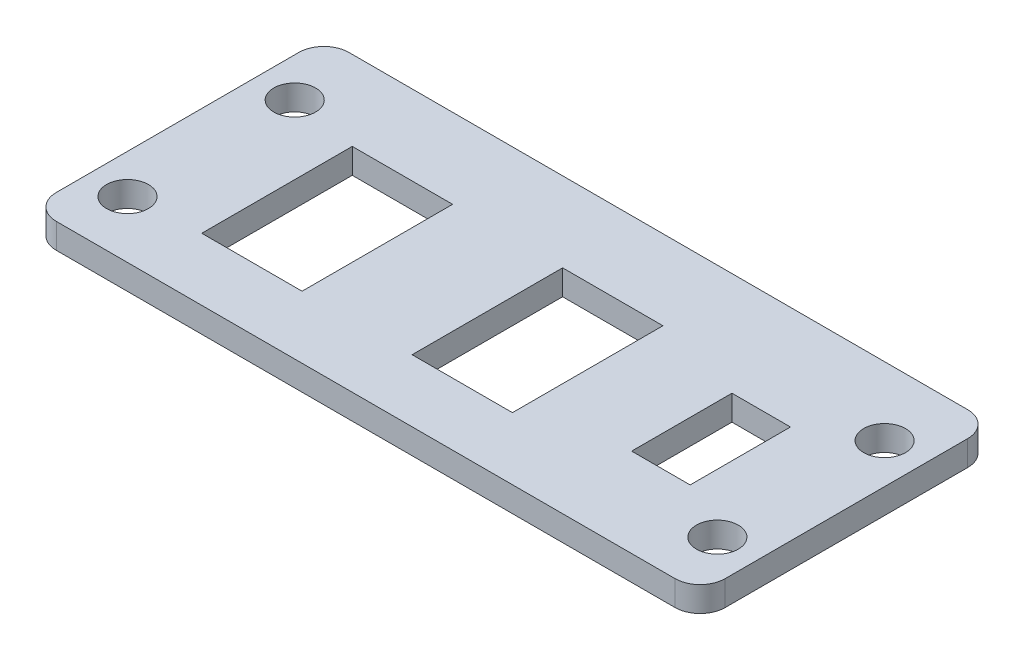
ISO-10303-21;
HEADER;
FILE_DESCRIPTION(('STEP AP214'),'2;1');
FILE_NAME('part.step','',(''),(''),'','','');
FILE_SCHEMA(('AUTOMOTIVE_DESIGN { 1 0 10303 214 1 1 1 1 }'));
ENDSEC;
DATA;
#1=APPLICATION_CONTEXT('core data for automotive mechanical design processes');
#2=APPLICATION_PROTOCOL_DEFINITION('international standard','automotive_design',2000,#1);
#3=PRODUCT_CONTEXT('',#1,'mechanical');
#4=PRODUCT('Part','Part','',(#3));
#5=PRODUCT_RELATED_PRODUCT_CATEGORY('part','',(#4));
#6=PRODUCT_DEFINITION_FORMATION('','',#4);
#7=PRODUCT_DEFINITION_CONTEXT('part definition',#1,'design');
#8=PRODUCT_DEFINITION('design','',#6,#7);
#9=PRODUCT_DEFINITION_SHAPE('','',#8);
#10=(LENGTH_UNIT() NAMED_UNIT(*) SI_UNIT(.MILLI.,.METRE.));
#11=(NAMED_UNIT(*) PLANE_ANGLE_UNIT() SI_UNIT($,.RADIAN.));
#12=(NAMED_UNIT(*) SI_UNIT($,.STERADIAN.) SOLID_ANGLE_UNIT());
#13=UNCERTAINTY_MEASURE_WITH_UNIT(LENGTH_MEASURE(1.E-05),#10,'distance_accuracy_value','');
#14=(GEOMETRIC_REPRESENTATION_CONTEXT(3) GLOBAL_UNCERTAINTY_ASSIGNED_CONTEXT((#13)) GLOBAL_UNIT_ASSIGNED_CONTEXT((#10,
#11,#12)) REPRESENTATION_CONTEXT('',''));
#15=CARTESIAN_POINT('',(0.,0.,0.));
#16=DIRECTION('',(0.,0.,1.));
#17=DIRECTION('',(1.,0.,0.));
#18=AXIS2_PLACEMENT_3D('',#15,#16,#17);
#19=CARTESIAN_POINT('',(0.,3.,0.));
#20=DIRECTION('',(0.,-1.,0.));
#21=DIRECTION('',(0.,0.,-1.));
#22=AXIS2_PLACEMENT_3D('',#19,#20,#21);
#23=PLANE('',#22);
#24=DIRECTION('',(0.,0.,1.));
#25=VECTOR('',#24,1.);
#26=CARTESIAN_POINT('',(332.334815931051,3.,75.4891037068991));
#27=LINE('',#26,#25);
#28=CARTESIAN_POINT('',(332.334815931051,3.,75.4891037068991));
#29=VERTEX_POINT('',#28);
#30=CARTESIAN_POINT('',(332.334815931051,3.,87.4891037068991));
#31=VERTEX_POINT('',#30);
#32=EDGE_CURVE('E411',#29,#31,#27,.T.);
#33=ORIENTED_EDGE('',*,*,#32,.F.);
#34=DIRECTION('',(-1.,0.,0.));
#35=VECTOR('',#34,1.);
#36=CARTESIAN_POINT('',(332.334815931051,3.,75.4891037068991));
#37=LINE('',#36,#35);
#38=CARTESIAN_POINT('',(339.334815931051,3.,75.4891037068991));
#39=VERTEX_POINT('',#38);
#40=EDGE_CURVE('E421',#39,#29,#37,.T.);
#41=ORIENTED_EDGE('',*,*,#40,.F.);
#42=DIRECTION('',(0.,0.,-1.));
#43=VECTOR('',#42,1.);
#44=CARTESIAN_POINT('',(339.334815931051,3.,75.4891037068991));
#45=LINE('',#44,#43);
#46=CARTESIAN_POINT('',(339.334815931051,3.,87.4891037068991));
#47=VERTEX_POINT('',#46);
#48=EDGE_CURVE('E426',#47,#39,#45,.T.);
#49=ORIENTED_EDGE('',*,*,#48,.F.);
#50=DIRECTION('',(1.,0.,0.));
#51=VECTOR('',#50,1.);
#52=CARTESIAN_POINT('',(332.334815931051,3.,87.4891037068991));
#53=LINE('',#52,#51);
#54=EDGE_CURVE('E414',#31,#47,#53,.T.);
#55=ORIENTED_EDGE('',*,*,#54,.F.);
#56=EDGE_LOOP('',(#33,#41,#49,#55));
#57=FACE_BOUND('',#56,.T.);
#58=DIRECTION('',(0.,0.,1.));
#59=VECTOR('',#58,1.);
#60=CARTESIAN_POINT('',(271.134650113553,3.,98.0957153332644));
#61=LINE('',#60,#59);
#62=CARTESIAN_POINT('',(271.134650113553,3.,66.0957153332644));
#63=VERTEX_POINT('',#62);
#64=CARTESIAN_POINT('',(271.134650113553,3.,95.0957153332644));
#65=VERTEX_POINT('',#64);
#66=EDGE_CURVE('E297',#63,#65,#61,.T.);
#67=ORIENTED_EDGE('',*,*,#66,.T.);
#68=CARTESIAN_POINT('',(274.134650113553,3.,95.0957153332644));
#69=DIRECTION('',(0.,-1.,0.));
#70=DIRECTION('',(0.,0.,-1.));
#71=AXIS2_PLACEMENT_3D('',#68,#69,#70);
#72=CIRCLE('',#71,3.);
#73=CARTESIAN_POINT('',(274.134650113553,3.,98.0957153332644));
#74=VERTEX_POINT('',#73);
#75=EDGE_CURVE('E353',#65,#74,#72,.F.);
#76=ORIENTED_EDGE('',*,*,#75,.T.);
#77=DIRECTION('',(1.,0.,0.));
#78=VECTOR('',#77,1.);
#79=CARTESIAN_POINT('',(271.134650113553,3.,98.0957153332644));
#80=LINE('',#79,#78);
#81=CARTESIAN_POINT('',(348.134650113553,3.,98.0957153332644));
#82=VERTEX_POINT('',#81);
#83=EDGE_CURVE('E302',#74,#82,#80,.T.);
#84=ORIENTED_EDGE('',*,*,#83,.T.);
#85=CARTESIAN_POINT('',(348.134650113553,3.,95.0957153332644));
#86=DIRECTION('',(0.,-1.,0.));
#87=DIRECTION('',(0.,0.,-1.));
#88=AXIS2_PLACEMENT_3D('',#85,#86,#87);
#89=CIRCLE('',#88,3.);
#90=CARTESIAN_POINT('',(351.134650113553,3.,95.0957153332644));
#91=VERTEX_POINT('',#90);
#92=EDGE_CURVE('E345',#82,#91,#89,.F.);
#93=ORIENTED_EDGE('',*,*,#92,.T.);
#94=DIRECTION('',(0.,0.,-1.));
#95=VECTOR('',#94,1.);
#96=CARTESIAN_POINT('',(351.134650113553,3.,98.0957153332644));
#97=LINE('',#96,#95);
#98=CARTESIAN_POINT('',(351.134650113553,3.,66.0957153332644));
#99=VERTEX_POINT('',#98);
#100=EDGE_CURVE('E311',#91,#99,#97,.T.);
#101=ORIENTED_EDGE('',*,*,#100,.T.);
#102=CARTESIAN_POINT('',(348.134650113553,3.,66.0957153332644));
#103=DIRECTION('',(0.,-1.,0.));
#104=DIRECTION('',(0.,0.,-1.));
#105=AXIS2_PLACEMENT_3D('',#102,#103,#104);
#106=CIRCLE('',#105,3.);
#107=CARTESIAN_POINT('',(348.134650113553,3.,63.0957153332644));
#108=VERTEX_POINT('',#107);
#109=EDGE_CURVE('E60',#99,#108,#106,.F.);
#110=ORIENTED_EDGE('',*,*,#109,.T.);
#111=DIRECTION('',(-1.,0.,0.));
#112=VECTOR('',#111,1.);
#113=CARTESIAN_POINT('',(271.134650113553,3.,63.0957153332644));
#114=LINE('',#113,#112);
#115=CARTESIAN_POINT('',(274.134650113553,3.,63.0957153332644));
#116=VERTEX_POINT('',#115);
#117=EDGE_CURVE('E314',#108,#116,#114,.T.);
#118=ORIENTED_EDGE('',*,*,#117,.T.);
#119=CARTESIAN_POINT('',(274.134650113553,3.,66.0957153332644));
#120=DIRECTION('',(0.,-1.,0.));
#121=DIRECTION('',(0.,0.,-1.));
#122=AXIS2_PLACEMENT_3D('',#119,#120,#121);
#123=CIRCLE('',#122,3.);
#124=EDGE_CURVE('E350',#116,#63,#123,.F.);
#125=ORIENTED_EDGE('',*,*,#124,.T.);
#126=EDGE_LOOP('',(#67,#76,#84,#93,#101,#110,#118,#125));
#127=FACE_BOUND('',#126,.T.);
#128=DIRECTION('',(0.,0.,1.));
#129=VECTOR('',#128,1.);
#130=CARTESIAN_POINT('',(309.220523963616,3.,72.6297014973218));
#131=LINE('',#130,#129);
#132=CARTESIAN_POINT('',(309.220523963616,3.,72.6297014973218));
#133=VERTEX_POINT('',#132);
#134=CARTESIAN_POINT('',(309.220523963616,3.,90.6297014973218));
#135=VERTEX_POINT('',#134);
#136=EDGE_CURVE('E257',#133,#135,#131,.T.);
#137=ORIENTED_EDGE('',*,*,#136,.F.);
#138=DIRECTION('',(-1.,0.,0.));
#139=VECTOR('',#138,1.);
#140=CARTESIAN_POINT('',(309.220523963616,3.,72.6297014973218));
#141=LINE('',#140,#139);
#142=CARTESIAN_POINT('',(321.220523963616,3.,72.6297014973218));
#143=VERTEX_POINT('',#142);
#144=EDGE_CURVE('E270',#143,#133,#141,.T.);
#145=ORIENTED_EDGE('',*,*,#144,.F.);
#146=DIRECTION('',(0.,0.,-1.));
#147=VECTOR('',#146,1.);
#148=CARTESIAN_POINT('',(321.220523963616,3.,72.6297014973218));
#149=LINE('',#148,#147);
#150=CARTESIAN_POINT('',(321.220523963616,3.,90.6297014973218));
#151=VERTEX_POINT('',#150);
#152=EDGE_CURVE('E275',#151,#143,#149,.T.);
#153=ORIENTED_EDGE('',*,*,#152,.F.);
#154=DIRECTION('',(1.,0.,0.));
#155=VECTOR('',#154,1.);
#156=CARTESIAN_POINT('',(309.220523963616,3.,90.6297014973218));
#157=LINE('',#156,#155);
#158=EDGE_CURVE('E260',#135,#151,#157,.T.);
#159=ORIENTED_EDGE('',*,*,#158,.F.);
#160=EDGE_LOOP('',(#137,#145,#153,#159));
#161=FACE_BOUND('',#160,.T.);
#162=CARTESIAN_POINT('',(275.818253152664,3.,71.2682978629817));
#163=DIRECTION('',(0.,1.,0.));
#164=DIRECTION('',(0.,0.,1.));
#165=AXIS2_PLACEMENT_3D('',#162,#163,#164);
#166=CIRCLE('',#165,2.50000000000002);
#167=CARTESIAN_POINT('',(275.818253152664,3.,73.7682978629818));
#168=VERTEX_POINT('',#167);
#169=EDGE_CURVE('E249',#168,#168,#166,.T.);
#170=ORIENTED_EDGE('',*,*,#169,.F.);
#171=EDGE_LOOP('',(#170));
#172=FACE_BOUND('',#171,.T.);
#173=CARTESIAN_POINT('',(275.818253152664,3.,91.2682978629817));
#174=DIRECTION('',(0.,1.,0.));
#175=DIRECTION('',(0.,0.,1.));
#176=AXIS2_PLACEMENT_3D('',#173,#174,#175);
#177=CIRCLE('',#176,2.50000000000002);
#178=CARTESIAN_POINT('',(275.818253152664,3.,93.7682978629818));
#179=VERTEX_POINT('',#178);
#180=EDGE_CURVE('E238',#179,#179,#177,.T.);
#181=ORIENTED_EDGE('',*,*,#180,.F.);
#182=EDGE_LOOP('',(#181));
#183=FACE_BOUND('',#182,.T.);
#184=CARTESIAN_POINT('',(346.370521359397,3.,71.2682978629817));
#185=DIRECTION('',(0.,1.,0.));
#186=DIRECTION('',(0.,0.,1.));
#187=AXIS2_PLACEMENT_3D('',#184,#185,#186);
#188=CIRCLE('',#187,2.50000000000002);
#189=CARTESIAN_POINT('',(346.370521359397,3.,73.7682978629818));
#190=VERTEX_POINT('',#189);
#191=EDGE_CURVE('E230',#190,#190,#188,.T.);
#192=ORIENTED_EDGE('',*,*,#191,.F.);
#193=EDGE_LOOP('',(#192));
#194=FACE_BOUND('',#193,.T.);
#195=CARTESIAN_POINT('',(346.370521359397,3.,91.2682978629817));
#196=DIRECTION('',(0.,1.,0.));
#197=DIRECTION('',(0.,0.,1.));
#198=AXIS2_PLACEMENT_3D('',#195,#196,#197);
#199=CIRCLE('',#198,2.50000000000002);
#200=CARTESIAN_POINT('',(346.370521359397,3.,93.7682978629818));
#201=VERTEX_POINT('',#200);
#202=EDGE_CURVE('E219',#201,#201,#199,.T.);
#203=ORIENTED_EDGE('',*,*,#202,.F.);
#204=EDGE_LOOP('',(#203));
#205=FACE_BOUND('',#204,.T.);
#206=DIRECTION('',(0.,0.,1.));
#207=VECTOR('',#206,1.);
#208=CARTESIAN_POINT('',(284.062529159449,3.,72.6297014973218));
#209=LINE('',#208,#207);
#210=CARTESIAN_POINT('',(284.062529159449,3.,72.6297014973218));
#211=VERTEX_POINT('',#210);
#212=CARTESIAN_POINT('',(284.062529159449,3.,90.6297014973218));
#213=VERTEX_POINT('',#212);
#214=EDGE_CURVE('E177',#211,#213,#209,.T.);
#215=ORIENTED_EDGE('',*,*,#214,.F.);
#216=DIRECTION('',(-1.,0.,0.));
#217=VECTOR('',#216,1.);
#218=CARTESIAN_POINT('',(284.062529159449,3.,72.6297014973218));
#219=LINE('',#218,#217);
#220=CARTESIAN_POINT('',(296.062529159449,3.,72.6297014973218));
#221=VERTEX_POINT('',#220);
#222=EDGE_CURVE('E204',#221,#211,#219,.T.);
#223=ORIENTED_EDGE('',*,*,#222,.F.);
#224=DIRECTION('',(0.,0.,-1.));
#225=VECTOR('',#224,1.);
#226=CARTESIAN_POINT('',(296.062529159449,3.,72.6297014973218));
#227=LINE('',#226,#225);
#228=CARTESIAN_POINT('',(296.062529159449,3.,90.6297014973218));
#229=VERTEX_POINT('',#228);
#230=EDGE_CURVE('E201',#229,#221,#227,.T.);
#231=ORIENTED_EDGE('',*,*,#230,.F.);
#232=DIRECTION('',(1.,0.,0.));
#233=VECTOR('',#232,1.);
#234=CARTESIAN_POINT('',(284.062529159449,3.,90.6297014973218));
#235=LINE('',#234,#233);
#236=EDGE_CURVE('E188',#213,#229,#235,.T.);
#237=ORIENTED_EDGE('',*,*,#236,.F.);
#238=EDGE_LOOP('',(#215,#223,#231,#237));
#239=FACE_BOUND('',#238,.T.);
#240=ADVANCED_FACE('F38',(#57,#127,#161,#172,#183,#194,#205,#239),#23,.F.);
#241=CARTESIAN_POINT('',(0.,0.,0.));
#242=DIRECTION('',(0.,-1.,0.));
#243=DIRECTION('',(0.,0.,-1.));
#244=AXIS2_PLACEMENT_3D('',#241,#242,#243);
#245=PLANE('',#244);
#246=CARTESIAN_POINT('',(346.370521359397,0.,71.2682978629817));
#247=DIRECTION('',(0.,1.,0.));
#248=DIRECTION('',(0.,0.,1.));
#249=AXIS2_PLACEMENT_3D('',#246,#247,#248);
#250=CIRCLE('',#249,2.50000000000002);
#251=CARTESIAN_POINT('',(346.370521359397,0.,73.7682978629818));
#252=VERTEX_POINT('',#251);
#253=EDGE_CURVE('E225',#252,#252,#250,.T.);
#254=ORIENTED_EDGE('',*,*,#253,.T.);
#255=EDGE_LOOP('',(#254));
#256=FACE_BOUND('',#255,.T.);
#257=CARTESIAN_POINT('',(275.818253152664,0.,71.2682978629817));
#258=DIRECTION('',(0.,1.,0.));
#259=DIRECTION('',(0.,0.,1.));
#260=AXIS2_PLACEMENT_3D('',#257,#258,#259);
#261=CIRCLE('',#260,2.50000000000002);
#262=CARTESIAN_POINT('',(275.818253152664,0.,73.7682978629818));
#263=VERTEX_POINT('',#262);
#264=EDGE_CURVE('E243',#263,#263,#261,.T.);
#265=ORIENTED_EDGE('',*,*,#264,.T.);
#266=EDGE_LOOP('',(#265));
#267=FACE_BOUND('',#266,.T.);
#268=DIRECTION('',(1.,0.,0.));
#269=VECTOR('',#268,1.);
#270=CARTESIAN_POINT('',(271.134650113553,0.,98.0957153332644));
#271=LINE('',#270,#269);
#272=CARTESIAN_POINT('',(274.134650113553,0.,98.0957153332644));
#273=VERTEX_POINT('',#272);
#274=CARTESIAN_POINT('',(348.134650113553,0.,98.0957153332644));
#275=VERTEX_POINT('',#274);
#276=EDGE_CURVE('E321',#273,#275,#271,.T.);
#277=ORIENTED_EDGE('',*,*,#276,.F.);
#278=CARTESIAN_POINT('',(274.134650113553,0.,95.0957153332644));
#279=DIRECTION('',(0.,-1.,0.));
#280=DIRECTION('',(0.,0.,-1.));
#281=AXIS2_PLACEMENT_3D('',#278,#279,#280);
#282=CIRCLE('',#281,3.);
#283=CARTESIAN_POINT('',(271.134650113553,0.,95.0957153332644));
#284=VERTEX_POINT('',#283);
#285=EDGE_CURVE('E338',#273,#284,#282,.T.);
#286=ORIENTED_EDGE('',*,*,#285,.T.);
#287=DIRECTION('',(0.,0.,1.));
#288=VECTOR('',#287,1.);
#289=CARTESIAN_POINT('',(271.134650113553,0.,98.0957153332644));
#290=LINE('',#289,#288);
#291=CARTESIAN_POINT('',(271.134650113553,0.,66.0957153332644));
#292=VERTEX_POINT('',#291);
#293=EDGE_CURVE('E296',#292,#284,#290,.T.);
#294=ORIENTED_EDGE('',*,*,#293,.F.);
#295=CARTESIAN_POINT('',(274.134650113553,0.,66.0957153332644));
#296=DIRECTION('',(0.,-1.,0.));
#297=DIRECTION('',(0.,0.,-1.));
#298=AXIS2_PLACEMENT_3D('',#295,#296,#297);
#299=CIRCLE('',#298,3.);
#300=CARTESIAN_POINT('',(274.134650113553,0.,63.0957153332644));
#301=VERTEX_POINT('',#300);
#302=EDGE_CURVE('E336',#292,#301,#299,.T.);
#303=ORIENTED_EDGE('',*,*,#302,.T.);
#304=DIRECTION('',(-1.,0.,0.));
#305=VECTOR('',#304,1.);
#306=CARTESIAN_POINT('',(271.134650113553,0.,63.0957153332644));
#307=LINE('',#306,#305);
#308=CARTESIAN_POINT('',(348.134650113553,0.,63.0957153332644));
#309=VERTEX_POINT('',#308);
#310=EDGE_CURVE('E303',#309,#301,#307,.T.);
#311=ORIENTED_EDGE('',*,*,#310,.F.);
#312=CARTESIAN_POINT('',(348.134650113553,0.,66.0957153332644));
#313=DIRECTION('',(0.,-1.,0.));
#314=DIRECTION('',(0.,0.,-1.));
#315=AXIS2_PLACEMENT_3D('',#312,#313,#314);
#316=CIRCLE('',#315,3.);
#317=CARTESIAN_POINT('',(351.134650113553,0.,66.0957153332644));
#318=VERTEX_POINT('',#317);
#319=EDGE_CURVE('E334',#309,#318,#316,.T.);
#320=ORIENTED_EDGE('',*,*,#319,.T.);
#321=DIRECTION('',(0.,0.,-1.));
#322=VECTOR('',#321,1.);
#323=CARTESIAN_POINT('',(351.134650113553,0.,98.0957153332644));
#324=LINE('',#323,#322);
#325=CARTESIAN_POINT('',(351.134650113553,0.,95.0957153332644));
#326=VERTEX_POINT('',#325);
#327=EDGE_CURVE('E324',#326,#318,#324,.T.);
#328=ORIENTED_EDGE('',*,*,#327,.F.);
#329=CARTESIAN_POINT('',(348.134650113553,0.,95.0957153332644));
#330=DIRECTION('',(0.,-1.,0.));
#331=DIRECTION('',(0.,0.,-1.));
#332=AXIS2_PLACEMENT_3D('',#329,#330,#331);
#333=CIRCLE('',#332,3.);
#334=EDGE_CURVE('E332',#326,#275,#333,.T.);
#335=ORIENTED_EDGE('',*,*,#334,.T.);
#336=EDGE_LOOP('',(#277,#286,#294,#303,#311,#320,#328,#335));
#337=FACE_BOUND('',#336,.T.);
#338=DIRECTION('',(-1.,0.,0.));
#339=VECTOR('',#338,1.);
#340=CARTESIAN_POINT('',(309.220523963616,0.,72.6297014973218));
#341=LINE('',#340,#339);
#342=CARTESIAN_POINT('',(321.220523963616,0.,72.6297014973218));
#343=VERTEX_POINT('',#342);
#344=CARTESIAN_POINT('',(309.220523963616,0.,72.6297014973218));
#345=VERTEX_POINT('',#344);
#346=EDGE_CURVE('E261',#343,#345,#341,.T.);
#347=ORIENTED_EDGE('',*,*,#346,.T.);
#348=DIRECTION('',(0.,0.,1.));
#349=VECTOR('',#348,1.);
#350=CARTESIAN_POINT('',(309.220523963616,0.,72.6297014973218));
#351=LINE('',#350,#349);
#352=CARTESIAN_POINT('',(309.220523963616,0.,90.6297014973218));
#353=VERTEX_POINT('',#352);
#354=EDGE_CURVE('E254',#345,#353,#351,.T.);
#355=ORIENTED_EDGE('',*,*,#354,.T.);
#356=DIRECTION('',(1.,0.,0.));
#357=VECTOR('',#356,1.);
#358=CARTESIAN_POINT('',(309.220523963616,0.,90.6297014973218));
#359=LINE('',#358,#357);
#360=CARTESIAN_POINT('',(321.220523963616,0.,90.6297014973218));
#361=VERTEX_POINT('',#360);
#362=EDGE_CURVE('E279',#353,#361,#359,.T.);
#363=ORIENTED_EDGE('',*,*,#362,.T.);
#364=DIRECTION('',(0.,0.,-1.));
#365=VECTOR('',#364,1.);
#366=CARTESIAN_POINT('',(321.220523963616,0.,72.6297014973218));
#367=LINE('',#366,#365);
#368=EDGE_CURVE('E282',#361,#343,#367,.T.);
#369=ORIENTED_EDGE('',*,*,#368,.T.);
#370=EDGE_LOOP('',(#347,#355,#363,#369));
#371=FACE_BOUND('',#370,.T.);
#372=CARTESIAN_POINT('',(275.818253152664,0.,91.2682978629817));
#373=DIRECTION('',(0.,1.,0.));
#374=DIRECTION('',(0.,0.,1.));
#375=AXIS2_PLACEMENT_3D('',#372,#373,#374);
#376=CIRCLE('',#375,2.50000000000002);
#377=CARTESIAN_POINT('',(275.818253152664,0.,93.7682978629818));
#378=VERTEX_POINT('',#377);
#379=EDGE_CURVE('E235',#378,#378,#376,.T.);
#380=ORIENTED_EDGE('',*,*,#379,.T.);
#381=EDGE_LOOP('',(#380));
#382=FACE_BOUND('',#381,.T.);
#383=CARTESIAN_POINT('',(346.370521359397,0.,91.2682978629817));
#384=DIRECTION('',(0.,1.,0.));
#385=DIRECTION('',(0.,0.,1.));
#386=AXIS2_PLACEMENT_3D('',#383,#384,#385);
#387=CIRCLE('',#386,2.50000000000002);
#388=CARTESIAN_POINT('',(346.370521359397,0.,93.7682978629818));
#389=VERTEX_POINT('',#388);
#390=EDGE_CURVE('E226',#389,#389,#387,.T.);
#391=ORIENTED_EDGE('',*,*,#390,.T.);
#392=EDGE_LOOP('',(#391));
#393=FACE_BOUND('',#392,.T.);
#394=DIRECTION('',(-1.,0.,0.));
#395=VECTOR('',#394,1.);
#396=CARTESIAN_POINT('',(332.334815931051,0.,75.4891037068991));
#397=LINE('',#396,#395);
#398=CARTESIAN_POINT('',(339.334815931051,0.,75.4891037068991));
#399=VERTEX_POINT('',#398);
#400=CARTESIAN_POINT('',(332.334815931051,0.,75.4891037068991));
#401=VERTEX_POINT('',#400);
#402=EDGE_CURVE('E415',#399,#401,#397,.T.);
#403=ORIENTED_EDGE('',*,*,#402,.T.);
#404=DIRECTION('',(0.,0.,1.));
#405=VECTOR('',#404,1.);
#406=CARTESIAN_POINT('',(332.334815931051,0.,75.4891037068991));
#407=LINE('',#406,#405);
#408=CARTESIAN_POINT('',(332.334815931051,0.,87.4891037068991));
#409=VERTEX_POINT('',#408);
#410=EDGE_CURVE('E196',#401,#409,#407,.T.);
#411=ORIENTED_EDGE('',*,*,#410,.T.);
#412=DIRECTION('',(1.,0.,0.));
#413=VECTOR('',#412,1.);
#414=CARTESIAN_POINT('',(332.334815931051,0.,87.4891037068991));
#415=LINE('',#414,#413);
#416=CARTESIAN_POINT('',(339.334815931051,0.,87.4891037068991));
#417=VERTEX_POINT('',#416);
#418=EDGE_CURVE('E430',#409,#417,#415,.T.);
#419=ORIENTED_EDGE('',*,*,#418,.T.);
#420=DIRECTION('',(0.,0.,-1.));
#421=VECTOR('',#420,1.);
#422=CARTESIAN_POINT('',(339.334815931051,0.,75.4891037068991));
#423=LINE('',#422,#421);
#424=EDGE_CURVE('E433',#417,#399,#423,.T.);
#425=ORIENTED_EDGE('',*,*,#424,.T.);
#426=EDGE_LOOP('',(#403,#411,#419,#425));
#427=FACE_BOUND('',#426,.T.);
#428=DIRECTION('',(-1.,0.,0.));
#429=VECTOR('',#428,1.);
#430=CARTESIAN_POINT('',(284.062529159449,0.,72.6297014973218));
#431=LINE('',#430,#429);
#432=CARTESIAN_POINT('',(296.062529159449,0.,72.6297014973218));
#433=VERTEX_POINT('',#432);
#434=CARTESIAN_POINT('',(284.062529159449,0.,72.6297014973218));
#435=VERTEX_POINT('',#434);
#436=EDGE_CURVE('E189',#433,#435,#431,.T.);
#437=ORIENTED_EDGE('',*,*,#436,.T.);
#438=DIRECTION('',(0.,0.,1.));
#439=VECTOR('',#438,1.);
#440=CARTESIAN_POINT('',(284.062529159449,0.,72.6297014973218));
#441=LINE('',#440,#439);
#442=CARTESIAN_POINT('',(284.062529159449,0.,90.6297014973218));
#443=VERTEX_POINT('',#442);
#444=EDGE_CURVE('E724',#435,#443,#441,.T.);
#445=ORIENTED_EDGE('',*,*,#444,.T.);
#446=DIRECTION('',(1.,0.,0.));
#447=VECTOR('',#446,1.);
#448=CARTESIAN_POINT('',(284.062529159449,0.,90.6297014973218));
#449=LINE('',#448,#447);
#450=CARTESIAN_POINT('',(296.062529159449,0.,90.6297014973218));
#451=VERTEX_POINT('',#450);
#452=EDGE_CURVE('E195',#443,#451,#449,.T.);
#453=ORIENTED_EDGE('',*,*,#452,.T.);
#454=DIRECTION('',(0.,0.,-1.));
#455=VECTOR('',#454,1.);
#456=CARTESIAN_POINT('',(296.062529159449,0.,72.6297014973218));
#457=LINE('',#456,#455);
#458=EDGE_CURVE('E723',#451,#433,#457,.T.);
#459=ORIENTED_EDGE('',*,*,#458,.T.);
#460=EDGE_LOOP('',(#437,#445,#453,#459));
#461=FACE_BOUND('',#460,.T.);
#462=ADVANCED_FACE('F370',(#256,#267,#337,#371,#382,#393,#427,#461),#245,.T.);
#463=CARTESIAN_POINT('',(271.134650113553,3.,98.0957153332644));
#464=DIRECTION('',(1.,0.,0.));
#465=DIRECTION('',(0.,0.,-1.));
#466=AXIS2_PLACEMENT_3D('',#463,#464,#465);
#467=PLANE('',#466);
#468=ORIENTED_EDGE('',*,*,#293,.T.);
#469=DIRECTION('',(0.,-1.,0.));
#470=VECTOR('',#469,1.);
#471=CARTESIAN_POINT('',(271.134650113553,3.,95.0957153332644));
#472=LINE('',#471,#470);
#473=EDGE_CURVE('E343',#284,#65,#472,.F.);
#474=ORIENTED_EDGE('',*,*,#473,.T.);
#475=ORIENTED_EDGE('',*,*,#66,.F.);
#476=DIRECTION('',(0.,-1.,0.));
#477=VECTOR('',#476,1.);
#478=CARTESIAN_POINT('',(271.134650113553,3.,66.0957153332644));
#479=LINE('',#478,#477);
#480=EDGE_CURVE('E340',#63,#292,#479,.T.);
#481=ORIENTED_EDGE('',*,*,#480,.T.);
#482=EDGE_LOOP('',(#468,#474,#475,#481));
#483=FACE_BOUND('',#482,.T.);
#484=ADVANCED_FACE('F385',(#483),#467,.F.);
#485=CARTESIAN_POINT('',(271.134650113553,3.,98.0957153332644));
#486=DIRECTION('',(0.,0.,-1.));
#487=DIRECTION('',(-1.,0.,0.));
#488=AXIS2_PLACEMENT_3D('',#485,#486,#487);
#489=PLANE('',#488);
#490=ORIENTED_EDGE('',*,*,#83,.F.);
#491=DIRECTION('',(0.,-1.,0.));
#492=VECTOR('',#491,1.);
#493=CARTESIAN_POINT('',(274.134650113553,3.,98.0957153332644));
#494=LINE('',#493,#492);
#495=EDGE_CURVE('E329',#74,#273,#494,.T.);
#496=ORIENTED_EDGE('',*,*,#495,.T.);
#497=ORIENTED_EDGE('',*,*,#276,.T.);
#498=DIRECTION('',(0.,-1.,0.));
#499=VECTOR('',#498,1.);
#500=CARTESIAN_POINT('',(348.134650113553,3.,98.0957153332644));
#501=LINE('',#500,#499);
#502=EDGE_CURVE('E318',#275,#82,#501,.F.);
#503=ORIENTED_EDGE('',*,*,#502,.T.);
#504=EDGE_LOOP('',(#490,#496,#497,#503));
#505=FACE_BOUND('',#504,.T.);
#506=ADVANCED_FACE('F393',(#505),#489,.F.);
#507=CARTESIAN_POINT('',(351.134650113553,3.,98.0957153332644));
#508=DIRECTION('',(-1.,0.,0.));
#509=DIRECTION('',(0.,0.,1.));
#510=AXIS2_PLACEMENT_3D('',#507,#508,#509);
#511=PLANE('',#510);
#512=ORIENTED_EDGE('',*,*,#327,.T.);
#513=DIRECTION('',(0.,-1.,0.));
#514=VECTOR('',#513,1.);
#515=CARTESIAN_POINT('',(351.134650113553,3.,66.0957153332644));
#516=LINE('',#515,#514);
#517=EDGE_CURVE('E12',#318,#99,#516,.F.);
#518=ORIENTED_EDGE('',*,*,#517,.T.);
#519=ORIENTED_EDGE('',*,*,#100,.F.);
#520=DIRECTION('',(0.,-1.,0.));
#521=VECTOR('',#520,1.);
#522=CARTESIAN_POINT('',(351.134650113553,3.,95.0957153332644));
#523=LINE('',#522,#521);
#524=EDGE_CURVE('E46',#91,#326,#523,.T.);
#525=ORIENTED_EDGE('',*,*,#524,.T.);
#526=EDGE_LOOP('',(#512,#518,#519,#525));
#527=FACE_BOUND('',#526,.T.);
#528=ADVANCED_FACE('F364',(#527),#511,.F.);
#529=CARTESIAN_POINT('',(271.134650113553,3.,63.0957153332644));
#530=DIRECTION('',(0.,0.,1.));
#531=DIRECTION('',(1.,0.,0.));
#532=AXIS2_PLACEMENT_3D('',#529,#530,#531);
#533=PLANE('',#532);
#534=ORIENTED_EDGE('',*,*,#310,.T.);
#535=DIRECTION('',(0.,-1.,0.));
#536=VECTOR('',#535,1.);
#537=CARTESIAN_POINT('',(274.134650113553,3.,63.0957153332644));
#538=LINE('',#537,#536);
#539=EDGE_CURVE('E53',#301,#116,#538,.F.);
#540=ORIENTED_EDGE('',*,*,#539,.T.);
#541=ORIENTED_EDGE('',*,*,#117,.F.);
#542=DIRECTION('',(0.,-1.,0.));
#543=VECTOR('',#542,1.);
#544=CARTESIAN_POINT('',(348.134650113553,3.,63.0957153332644));
#545=LINE('',#544,#543);
#546=EDGE_CURVE('E356',#108,#309,#545,.T.);
#547=ORIENTED_EDGE('',*,*,#546,.T.);
#548=EDGE_LOOP('',(#534,#540,#541,#547));
#549=FACE_BOUND('',#548,.T.);
#550=ADVANCED_FACE('F376',(#549),#533,.F.);
#551=CARTESIAN_POINT('',(309.220523963616,3.,72.6297014973218));
#552=DIRECTION('',(1.,0.,0.));
#553=DIRECTION('',(0.,0.,-1.));
#554=AXIS2_PLACEMENT_3D('',#551,#552,#553);
#555=PLANE('',#554);
#556=ORIENTED_EDGE('',*,*,#354,.F.);
#557=DIRECTION('',(0.,-1.,0.));
#558=VECTOR('',#557,1.);
#559=CARTESIAN_POINT('',(309.220523963616,3.,72.6297014973218));
#560=LINE('',#559,#558);
#561=EDGE_CURVE('E274',#133,#345,#560,.T.);
#562=ORIENTED_EDGE('',*,*,#561,.F.);
#563=ORIENTED_EDGE('',*,*,#136,.T.);
#564=DIRECTION('',(0.,-1.,0.));
#565=VECTOR('',#564,1.);
#566=CARTESIAN_POINT('',(309.220523963616,3.,90.6297014973218));
#567=LINE('',#566,#565);
#568=EDGE_CURVE('E293',#135,#353,#567,.T.);
#569=ORIENTED_EDGE('',*,*,#568,.T.);
#570=EDGE_LOOP('',(#556,#562,#563,#569));
#571=FACE_BOUND('',#570,.T.);
#572=ADVANCED_FACE('F482',(#571),#555,.T.);
#573=CARTESIAN_POINT('',(309.220523963616,3.,90.6297014973218));
#574=DIRECTION('',(0.,0.,-1.));
#575=DIRECTION('',(-1.,0.,0.));
#576=AXIS2_PLACEMENT_3D('',#573,#574,#575);
#577=PLANE('',#576);
#578=ORIENTED_EDGE('',*,*,#362,.F.);
#579=ORIENTED_EDGE('',*,*,#568,.F.);
#580=ORIENTED_EDGE('',*,*,#158,.T.);
#581=DIRECTION('',(0.,-1.,0.));
#582=VECTOR('',#581,1.);
#583=CARTESIAN_POINT('',(321.220523963616,3.,90.6297014973218));
#584=LINE('',#583,#582);
#585=EDGE_CURVE('E291',#151,#361,#584,.T.);
#586=ORIENTED_EDGE('',*,*,#585,.T.);
#587=EDGE_LOOP('',(#578,#579,#580,#586));
#588=FACE_BOUND('',#587,.T.);
#589=ADVANCED_FACE('F673',(#588),#577,.T.);
#590=CARTESIAN_POINT('',(321.220523963616,3.,72.6297014973218));
#591=DIRECTION('',(-1.,0.,0.));
#592=DIRECTION('',(0.,0.,1.));
#593=AXIS2_PLACEMENT_3D('',#590,#591,#592);
#594=PLANE('',#593);
#595=ORIENTED_EDGE('',*,*,#368,.F.);
#596=ORIENTED_EDGE('',*,*,#585,.F.);
#597=ORIENTED_EDGE('',*,*,#152,.T.);
#598=DIRECTION('',(0.,-1.,0.));
#599=VECTOR('',#598,1.);
#600=CARTESIAN_POINT('',(321.220523963616,3.,72.6297014973218));
#601=LINE('',#600,#599);
#602=EDGE_CURVE('E289',#143,#343,#601,.T.);
#603=ORIENTED_EDGE('',*,*,#602,.T.);
#604=EDGE_LOOP('',(#595,#596,#597,#603));
#605=FACE_BOUND('',#604,.T.);
#606=ADVANCED_FACE('F663',(#605),#594,.T.);
#607=CARTESIAN_POINT('',(309.220523963616,3.,72.6297014973218));
#608=DIRECTION('',(0.,0.,1.));
#609=DIRECTION('',(1.,0.,0.));
#610=AXIS2_PLACEMENT_3D('',#607,#608,#609);
#611=PLANE('',#610);
#612=ORIENTED_EDGE('',*,*,#346,.F.);
#613=ORIENTED_EDGE('',*,*,#602,.F.);
#614=ORIENTED_EDGE('',*,*,#144,.T.);
#615=ORIENTED_EDGE('',*,*,#561,.T.);
#616=EDGE_LOOP('',(#612,#613,#614,#615));
#617=FACE_BOUND('',#616,.T.);
#618=ADVANCED_FACE('F653',(#617),#611,.T.);
#619=CARTESIAN_POINT('',(275.818253152664,3.,71.2682978629817));
#620=DIRECTION('',(0.,-1.,0.));
#621=DIRECTION('',(0.,0.,-1.));
#622=AXIS2_PLACEMENT_3D('',#619,#620,#621);
#623=CYLINDRICAL_SURFACE('',#622,2.50000000000002);
#624=ORIENTED_EDGE('',*,*,#169,.T.);
#625=EDGE_LOOP('',(#624));
#626=FACE_BOUND('',#625,.T.);
#627=ORIENTED_EDGE('',*,*,#264,.F.);
#628=EDGE_LOOP('',(#627));
#629=FACE_BOUND('',#628,.T.);
#630=ADVANCED_FACE('F643',(#626,#629),#623,.F.);
#631=CARTESIAN_POINT('',(275.818253152664,3.,91.2682978629817));
#632=DIRECTION('',(0.,-1.,0.));
#633=DIRECTION('',(0.,0.,-1.));
#634=AXIS2_PLACEMENT_3D('',#631,#632,#633);
#635=CYLINDRICAL_SURFACE('',#634,2.50000000000002);
#636=ORIENTED_EDGE('',*,*,#180,.T.);
#637=EDGE_LOOP('',(#636));
#638=FACE_BOUND('',#637,.T.);
#639=ORIENTED_EDGE('',*,*,#379,.F.);
#640=EDGE_LOOP('',(#639));
#641=FACE_BOUND('',#640,.T.);
#642=ADVANCED_FACE('F633',(#638,#641),#635,.F.);
#643=CARTESIAN_POINT('',(346.370521359397,3.,71.2682978629817));
#644=DIRECTION('',(0.,-1.,0.));
#645=DIRECTION('',(0.,0.,-1.));
#646=AXIS2_PLACEMENT_3D('',#643,#644,#645);
#647=CYLINDRICAL_SURFACE('',#646,2.50000000000002);
#648=ORIENTED_EDGE('',*,*,#191,.T.);
#649=EDGE_LOOP('',(#648));
#650=FACE_BOUND('',#649,.T.);
#651=ORIENTED_EDGE('',*,*,#253,.F.);
#652=EDGE_LOOP('',(#651));
#653=FACE_BOUND('',#652,.T.);
#654=ADVANCED_FACE('F623',(#650,#653),#647,.F.);
#655=CARTESIAN_POINT('',(346.370521359397,3.,91.2682978629817));
#656=DIRECTION('',(0.,-1.,0.));
#657=DIRECTION('',(0.,0.,-1.));
#658=AXIS2_PLACEMENT_3D('',#655,#656,#657);
#659=CYLINDRICAL_SURFACE('',#658,2.50000000000002);
#660=ORIENTED_EDGE('',*,*,#202,.T.);
#661=EDGE_LOOP('',(#660));
#662=FACE_BOUND('',#661,.T.);
#663=ORIENTED_EDGE('',*,*,#390,.F.);
#664=EDGE_LOOP('',(#663));
#665=FACE_BOUND('',#664,.T.);
#666=ADVANCED_FACE('F614',(#662,#665),#659,.F.);
#667=CARTESIAN_POINT('',(332.334815931051,3.,75.4891037068991));
#668=DIRECTION('',(1.,0.,0.));
#669=DIRECTION('',(0.,0.,-1.));
#670=AXIS2_PLACEMENT_3D('',#667,#668,#669);
#671=PLANE('',#670);
#672=ORIENTED_EDGE('',*,*,#410,.F.);
#673=DIRECTION('',(0.,-1.,0.));
#674=VECTOR('',#673,1.);
#675=CARTESIAN_POINT('',(332.334815931051,3.,75.4891037068991));
#676=LINE('',#675,#674);
#677=EDGE_CURVE('E425',#29,#401,#676,.T.);
#678=ORIENTED_EDGE('',*,*,#677,.F.);
#679=ORIENTED_EDGE('',*,*,#32,.T.);
#680=DIRECTION('',(0.,-1.,0.));
#681=VECTOR('',#680,1.);
#682=CARTESIAN_POINT('',(332.334815931051,3.,87.4891037068991));
#683=LINE('',#682,#681);
#684=EDGE_CURVE('E227',#31,#409,#683,.T.);
#685=ORIENTED_EDGE('',*,*,#684,.T.);
#686=EDGE_LOOP('',(#672,#678,#679,#685));
#687=FACE_BOUND('',#686,.T.);
#688=ADVANCED_FACE('F448',(#687),#671,.T.);
#689=CARTESIAN_POINT('',(332.334815931051,3.,87.4891037068991));
#690=DIRECTION('',(0.,0.,-1.));
#691=DIRECTION('',(-1.,0.,0.));
#692=AXIS2_PLACEMENT_3D('',#689,#690,#691);
#693=PLANE('',#692);
#694=ORIENTED_EDGE('',*,*,#418,.F.);
#695=ORIENTED_EDGE('',*,*,#684,.F.);
#696=ORIENTED_EDGE('',*,*,#54,.T.);
#697=DIRECTION('',(0.,-1.,0.));
#698=VECTOR('',#697,1.);
#699=CARTESIAN_POINT('',(339.334815931051,3.,87.4891037068991));
#700=LINE('',#699,#698);
#701=EDGE_CURVE('E441',#47,#417,#700,.T.);
#702=ORIENTED_EDGE('',*,*,#701,.T.);
#703=EDGE_LOOP('',(#694,#695,#696,#702));
#704=FACE_BOUND('',#703,.T.);
#705=ADVANCED_FACE('F466',(#704),#693,.T.);
#706=CARTESIAN_POINT('',(339.334815931051,3.,75.4891037068991));
#707=DIRECTION('',(-1.,0.,0.));
#708=DIRECTION('',(0.,0.,1.));
#709=AXIS2_PLACEMENT_3D('',#706,#707,#708);
#710=PLANE('',#709);
#711=ORIENTED_EDGE('',*,*,#424,.F.);
#712=ORIENTED_EDGE('',*,*,#701,.F.);
#713=ORIENTED_EDGE('',*,*,#48,.T.);
#714=DIRECTION('',(0.,-1.,0.));
#715=VECTOR('',#714,1.);
#716=CARTESIAN_POINT('',(339.334815931051,3.,75.4891037068991));
#717=LINE('',#716,#715);
#718=EDGE_CURVE('E440',#39,#399,#717,.T.);
#719=ORIENTED_EDGE('',*,*,#718,.T.);
#720=EDGE_LOOP('',(#711,#712,#713,#719));
#721=FACE_BOUND('',#720,.T.);
#722=ADVANCED_FACE('F464',(#721),#710,.T.);
#723=CARTESIAN_POINT('',(332.334815931051,3.,75.4891037068991));
#724=DIRECTION('',(0.,0.,1.));
#725=DIRECTION('',(1.,0.,0.));
#726=AXIS2_PLACEMENT_3D('',#723,#724,#725);
#727=PLANE('',#726);
#728=ORIENTED_EDGE('',*,*,#402,.F.);
#729=ORIENTED_EDGE('',*,*,#718,.F.);
#730=ORIENTED_EDGE('',*,*,#40,.T.);
#731=ORIENTED_EDGE('',*,*,#677,.T.);
#732=EDGE_LOOP('',(#728,#729,#730,#731));
#733=FACE_BOUND('',#732,.T.);
#734=ADVANCED_FACE('F456',(#733),#727,.T.);
#735=CARTESIAN_POINT('',(284.062529159449,3.,72.6297014973218));
#736=DIRECTION('',(1.,0.,0.));
#737=DIRECTION('',(0.,0.,-1.));
#738=AXIS2_PLACEMENT_3D('',#735,#736,#737);
#739=PLANE('',#738);
#740=ORIENTED_EDGE('',*,*,#444,.F.);
#741=DIRECTION('',(0.,-1.,0.));
#742=VECTOR('',#741,1.);
#743=CARTESIAN_POINT('',(284.062529159449,3.,72.6297014973218));
#744=LINE('',#743,#742);
#745=EDGE_CURVE('E183',#211,#435,#744,.T.);
#746=ORIENTED_EDGE('',*,*,#745,.F.);
#747=ORIENTED_EDGE('',*,*,#214,.T.);
#748=DIRECTION('',(0.,-1.,0.));
#749=VECTOR('',#748,1.);
#750=CARTESIAN_POINT('',(284.062529159449,3.,90.6297014973218));
#751=LINE('',#750,#749);
#752=EDGE_CURVE('E180',#213,#443,#751,.T.);
#753=ORIENTED_EDGE('',*,*,#752,.T.);
#754=EDGE_LOOP('',(#740,#746,#747,#753));
#755=FACE_BOUND('',#754,.T.);
#756=ADVANCED_FACE('F179',(#755),#739,.T.);
#757=CARTESIAN_POINT('',(284.062529159449,3.,90.6297014973218));
#758=DIRECTION('',(0.,0.,-1.));
#759=DIRECTION('',(-1.,0.,0.));
#760=AXIS2_PLACEMENT_3D('',#757,#758,#759);
#761=PLANE('',#760);
#762=ORIENTED_EDGE('',*,*,#452,.F.);
#763=ORIENTED_EDGE('',*,*,#752,.F.);
#764=ORIENTED_EDGE('',*,*,#236,.T.);
#765=DIRECTION('',(0.,-1.,0.));
#766=VECTOR('',#765,1.);
#767=CARTESIAN_POINT('',(296.062529159449,3.,90.6297014973218));
#768=LINE('',#767,#766);
#769=EDGE_CURVE('E197',#229,#451,#768,.T.);
#770=ORIENTED_EDGE('',*,*,#769,.T.);
#771=EDGE_LOOP('',(#762,#763,#764,#770));
#772=FACE_BOUND('',#771,.T.);
#773=ADVANCED_FACE('F192',(#772),#761,.T.);
#774=CARTESIAN_POINT('',(296.062529159449,3.,72.6297014973218));
#775=DIRECTION('',(-1.,0.,0.));
#776=DIRECTION('',(0.,0.,1.));
#777=AXIS2_PLACEMENT_3D('',#774,#775,#776);
#778=PLANE('',#777);
#779=ORIENTED_EDGE('',*,*,#458,.F.);
#780=ORIENTED_EDGE('',*,*,#769,.F.);
#781=ORIENTED_EDGE('',*,*,#230,.T.);
#782=DIRECTION('',(0.,-1.,0.));
#783=VECTOR('',#782,1.);
#784=CARTESIAN_POINT('',(296.062529159449,3.,72.6297014973218));
#785=LINE('',#784,#783);
#786=EDGE_CURVE('E402',#221,#433,#785,.T.);
#787=ORIENTED_EDGE('',*,*,#786,.T.);
#788=EDGE_LOOP('',(#779,#780,#781,#787));
#789=FACE_BOUND('',#788,.T.);
#790=ADVANCED_FACE('F564',(#789),#778,.T.);
#791=CARTESIAN_POINT('',(284.062529159449,3.,72.6297014973218));
#792=DIRECTION('',(0.,0.,1.));
#793=DIRECTION('',(1.,0.,0.));
#794=AXIS2_PLACEMENT_3D('',#791,#792,#793);
#795=PLANE('',#794);
#796=ORIENTED_EDGE('',*,*,#436,.F.);
#797=ORIENTED_EDGE('',*,*,#786,.F.);
#798=ORIENTED_EDGE('',*,*,#222,.T.);
#799=ORIENTED_EDGE('',*,*,#745,.T.);
#800=EDGE_LOOP('',(#796,#797,#798,#799));
#801=FACE_BOUND('',#800,.T.);
#802=ADVANCED_FACE('F495',(#801),#795,.T.);
#803=CARTESIAN_POINT('',(274.134650113553,3.,95.0957153332644));
#804=DIRECTION('',(0.,-1.,0.));
#805=DIRECTION('',(0.,0.,-1.));
#806=AXIS2_PLACEMENT_3D('',#803,#804,#805);
#807=CYLINDRICAL_SURFACE('',#806,3.);
#808=ORIENTED_EDGE('',*,*,#75,.F.);
#809=ORIENTED_EDGE('',*,*,#473,.F.);
#810=ORIENTED_EDGE('',*,*,#285,.F.);
#811=ORIENTED_EDGE('',*,*,#495,.F.);
#812=EDGE_LOOP('',(#808,#809,#810,#811));
#813=FACE_BOUND('',#812,.T.);
#814=ADVANCED_FACE('F390',(#813),#807,.T.);
#815=CARTESIAN_POINT('',(274.134650113553,3.,66.0957153332644));
#816=DIRECTION('',(0.,-1.,0.));
#817=DIRECTION('',(0.,0.,-1.));
#818=AXIS2_PLACEMENT_3D('',#815,#816,#817);
#819=CYLINDRICAL_SURFACE('',#818,3.);
#820=ORIENTED_EDGE('',*,*,#124,.F.);
#821=ORIENTED_EDGE('',*,*,#539,.F.);
#822=ORIENTED_EDGE('',*,*,#302,.F.);
#823=ORIENTED_EDGE('',*,*,#480,.F.);
#824=EDGE_LOOP('',(#820,#821,#822,#823));
#825=FACE_BOUND('',#824,.T.);
#826=ADVANCED_FACE('F382',(#825),#819,.T.);
#827=CARTESIAN_POINT('',(348.134650113553,3.,66.0957153332644));
#828=DIRECTION('',(0.,-1.,0.));
#829=DIRECTION('',(0.,0.,-1.));
#830=AXIS2_PLACEMENT_3D('',#827,#828,#829);
#831=CYLINDRICAL_SURFACE('',#830,3.);
#832=ORIENTED_EDGE('',*,*,#109,.F.);
#833=ORIENTED_EDGE('',*,*,#517,.F.);
#834=ORIENTED_EDGE('',*,*,#319,.F.);
#835=ORIENTED_EDGE('',*,*,#546,.F.);
#836=EDGE_LOOP('',(#832,#833,#834,#835));
#837=FACE_BOUND('',#836,.T.);
#838=ADVANCED_FACE('F375',(#837),#831,.T.);
#839=CARTESIAN_POINT('',(348.134650113553,3.,95.0957153332644));
#840=DIRECTION('',(0.,-1.,0.));
#841=DIRECTION('',(0.,0.,-1.));
#842=AXIS2_PLACEMENT_3D('',#839,#840,#841);
#843=CYLINDRICAL_SURFACE('',#842,3.);
#844=ORIENTED_EDGE('',*,*,#92,.F.);
#845=ORIENTED_EDGE('',*,*,#502,.F.);
#846=ORIENTED_EDGE('',*,*,#334,.F.);
#847=ORIENTED_EDGE('',*,*,#524,.F.);
#848=EDGE_LOOP('',(#844,#845,#846,#847));
#849=FACE_BOUND('',#848,.T.);
#850=ADVANCED_FACE('F40',(#849),#843,.T.);
#851=CLOSED_SHELL('',(#240,#462,#484,#506,#528,#550,#572,#589,#606,#618,#630,#642,#654,#666,
#688,#705,#722,#734,#756,#773,#790,#802,#814,#826,#838,#850));
#852=MANIFOLD_SOLID_BREP('B2',#851);
#853=ADVANCED_BREP_SHAPE_REPRESENTATION('',(#18,#852),#14);
#854=SHAPE_DEFINITION_REPRESENTATION(#9,#853);
ENDSEC;
END-ISO-10303-21;
